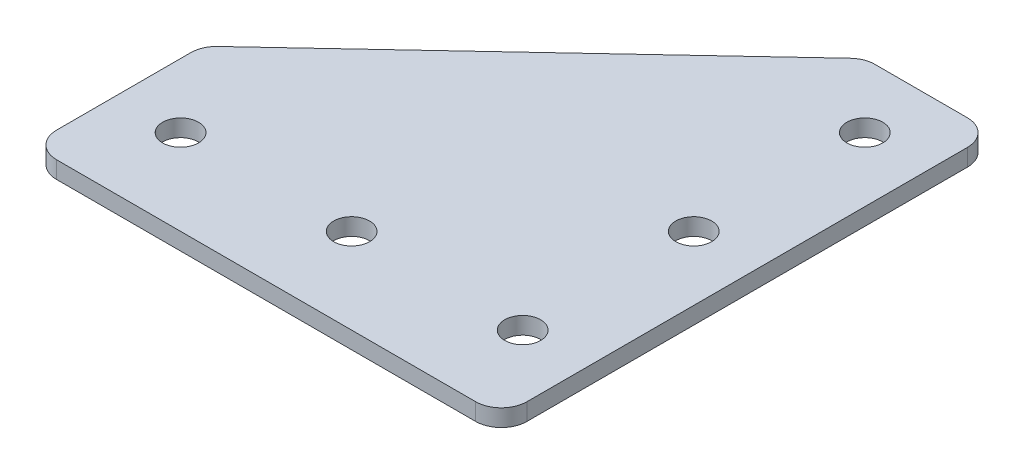
ISO-10303-21;
HEADER;
FILE_DESCRIPTION(('STEP AP214'),'2;1');
FILE_NAME('part.step','',(''),(''),'','','');
FILE_SCHEMA(('AUTOMOTIVE_DESIGN { 1 0 10303 214 1 1 1 1 }'));
ENDSEC;
DATA;
#1=APPLICATION_CONTEXT('core data for automotive mechanical design processes');
#2=APPLICATION_PROTOCOL_DEFINITION('international standard','automotive_design',2000,#1);
#3=PRODUCT_CONTEXT('',#1,'mechanical');
#4=PRODUCT('Part','Part','',(#3));
#5=PRODUCT_RELATED_PRODUCT_CATEGORY('part','',(#4));
#6=PRODUCT_DEFINITION_FORMATION('','',#4);
#7=PRODUCT_DEFINITION_CONTEXT('part definition',#1,'design');
#8=PRODUCT_DEFINITION('design','',#6,#7);
#9=PRODUCT_DEFINITION_SHAPE('','',#8);
#10=(LENGTH_UNIT() NAMED_UNIT(*) SI_UNIT(.MILLI.,.METRE.));
#11=(NAMED_UNIT(*) PLANE_ANGLE_UNIT() SI_UNIT($,.RADIAN.));
#12=(NAMED_UNIT(*) SI_UNIT($,.STERADIAN.) SOLID_ANGLE_UNIT());
#13=UNCERTAINTY_MEASURE_WITH_UNIT(LENGTH_MEASURE(1.E-05),#10,'distance_accuracy_value','');
#14=(GEOMETRIC_REPRESENTATION_CONTEXT(3) GLOBAL_UNCERTAINTY_ASSIGNED_CONTEXT((#13)) GLOBAL_UNIT_ASSIGNED_CONTEXT((#10,
#11,#12)) REPRESENTATION_CONTEXT('',''));
#15=CARTESIAN_POINT('',(0.,0.,0.));
#16=DIRECTION('',(0.,0.,1.));
#17=DIRECTION('',(1.,0.,0.));
#18=AXIS2_PLACEMENT_3D('',#15,#16,#17);
#19=CARTESIAN_POINT('',(0.,2.,0.));
#20=DIRECTION('',(0.,1.,0.));
#21=DIRECTION('',(0.,0.,1.));
#22=AXIS2_PLACEMENT_3D('',#19,#20,#21);
#23=PLANE('',#22);
#24=CARTESIAN_POINT('',(47.5,2.,-50.));
#25=DIRECTION('',(0.,1.,0.));
#26=DIRECTION('',(0.,0.,1.));
#27=AXIS2_PLACEMENT_3D('',#24,#25,#26);
#28=CIRCLE('',#27,2.1);
#29=CARTESIAN_POINT('',(47.5,2.,-47.9));
#30=VERTEX_POINT('',#29);
#31=EDGE_CURVE('E403',#30,#30,#28,.T.);
#32=ORIENTED_EDGE('',*,*,#31,.F.);
#33=EDGE_LOOP('',(#32));
#34=FACE_BOUND('',#33,.T.);
#35=CARTESIAN_POINT('',(47.5,2.,-10.));
#36=DIRECTION('',(0.,1.,0.));
#37=DIRECTION('',(0.,0.,1.));
#38=AXIS2_PLACEMENT_3D('',#35,#36,#37);
#39=CIRCLE('',#38,2.1);
#40=CARTESIAN_POINT('',(47.5,2.,-7.90000000000001));
#41=VERTEX_POINT('',#40);
#42=EDGE_CURVE('E211',#41,#41,#39,.T.);
#43=ORIENTED_EDGE('',*,*,#42,.F.);
#44=EDGE_LOOP('',(#43));
#45=FACE_BOUND('',#44,.T.);
#46=DIRECTION('',(1.,0.,0.));
#47=VECTOR('',#46,1.);
#48=CARTESIAN_POINT('',(0.,2.,0.));
#49=LINE('',#48,#47);
#50=CARTESIAN_POINT('',(3.,2.,0.));
#51=VERTEX_POINT('',#50);
#52=CARTESIAN_POINT('',(52.,2.,0.));
#53=VERTEX_POINT('',#52);
#54=EDGE_CURVE('E219',#51,#53,#49,.T.);
#55=ORIENTED_EDGE('',*,*,#54,.T.);
#56=CARTESIAN_POINT('',(52.,2.,-3.));
#57=DIRECTION('',(0.,1.,0.));
#58=DIRECTION('',(0.,0.,1.));
#59=AXIS2_PLACEMENT_3D('',#56,#57,#58);
#60=CIRCLE('',#59,3.);
#61=CARTESIAN_POINT('',(55.,2.,-3.));
#62=VERTEX_POINT('',#61);
#63=EDGE_CURVE('E172',#53,#62,#60,.T.);
#64=ORIENTED_EDGE('',*,*,#63,.T.);
#65=DIRECTION('',(0.,0.,-1.));
#66=VECTOR('',#65,1.);
#67=CARTESIAN_POINT('',(55.,2.,-57.5));
#68=LINE('',#67,#66);
#69=CARTESIAN_POINT('',(55.,2.,-54.5));
#70=VERTEX_POINT('',#69);
#71=EDGE_CURVE('E135',#62,#70,#68,.T.);
#72=ORIENTED_EDGE('',*,*,#71,.T.);
#73=CARTESIAN_POINT('',(52.,2.,-54.5));
#74=DIRECTION('',(0.,1.,0.));
#75=DIRECTION('',(0.,0.,1.));
#76=AXIS2_PLACEMENT_3D('',#73,#74,#75);
#77=CIRCLE('',#76,3.);
#78=CARTESIAN_POINT('',(52.,2.,-57.5));
#79=VERTEX_POINT('',#78);
#80=EDGE_CURVE('E165',#70,#79,#77,.T.);
#81=ORIENTED_EDGE('',*,*,#80,.T.);
#82=DIRECTION('',(-1.,0.,0.));
#83=VECTOR('',#82,1.);
#84=CARTESIAN_POINT('',(55.,2.,-57.5));
#85=LINE('',#84,#83);
#86=CARTESIAN_POINT('',(41.1863424398923,2.,-57.5));
#87=VERTEX_POINT('',#86);
#88=EDGE_CURVE('E188',#79,#87,#85,.T.);
#89=ORIENTED_EDGE('',*,*,#88,.T.);
#90=CARTESIAN_POINT('',(41.1863424398923,2.,-54.5));
#91=DIRECTION('',(0.,1.,0.));
#92=DIRECTION('',(0.,0.,1.));
#93=AXIS2_PLACEMENT_3D('',#90,#91,#92);
#94=CIRCLE('',#93,3.);
#95=CARTESIAN_POINT('',(39.1345190532483,2.,-56.6886116124203));
#96=VERTEX_POINT('',#95);
#97=EDGE_CURVE('E59',#87,#96,#94,.T.);
#98=ORIENTED_EDGE('',*,*,#97,.T.);
#99=DIRECTION('',(-0.729537204140085,0.,0.68394112888133));
#100=VECTOR('',#99,1.);
#101=CARTESIAN_POINT('',(40.,2.,-57.5));
#102=LINE('',#101,#100);
#103=CARTESIAN_POINT('',(0.948176613356,2.,-20.8889155750212));
#104=VERTEX_POINT('',#103);
#105=EDGE_CURVE('E154',#96,#104,#102,.T.);
#106=ORIENTED_EDGE('',*,*,#105,.T.);
#107=CARTESIAN_POINT('',(3.,2.,-18.700303962601));
#108=DIRECTION('',(0.,1.,0.));
#109=DIRECTION('',(0.,0.,1.));
#110=AXIS2_PLACEMENT_3D('',#107,#108,#109);
#111=CIRCLE('',#110,3.);
#112=CARTESIAN_POINT('',(0.,2.,-18.700303962601));
#113=VERTEX_POINT('',#112);
#114=EDGE_CURVE('E170',#104,#113,#111,.T.);
#115=ORIENTED_EDGE('',*,*,#114,.T.);
#116=DIRECTION('',(0.,0.,1.));
#117=VECTOR('',#116,1.);
#118=CARTESIAN_POINT('',(0.,2.,-20.));
#119=LINE('',#118,#117);
#120=CARTESIAN_POINT('',(0.,2.,-3.));
#121=VERTEX_POINT('',#120);
#122=EDGE_CURVE('E153',#113,#121,#119,.T.);
#123=ORIENTED_EDGE('',*,*,#122,.T.);
#124=CARTESIAN_POINT('',(3.,2.,-3.));
#125=DIRECTION('',(0.,1.,0.));
#126=DIRECTION('',(0.,0.,1.));
#127=AXIS2_PLACEMENT_3D('',#124,#125,#126);
#128=CIRCLE('',#127,3.);
#129=EDGE_CURVE('E168',#121,#51,#128,.T.);
#130=ORIENTED_EDGE('',*,*,#129,.T.);
#131=EDGE_LOOP('',(#55,#64,#72,#81,#89,#98,#106,#115,#123,#130));
#132=FACE_BOUND('',#131,.T.);
#133=CARTESIAN_POINT('',(7.5,2.,-10.));
#134=DIRECTION('',(0.,1.,0.));
#135=DIRECTION('',(0.,0.,1.));
#136=AXIS2_PLACEMENT_3D('',#133,#134,#135);
#137=CIRCLE('',#136,2.1);
#138=CARTESIAN_POINT('',(7.5,2.,-7.9));
#139=VERTEX_POINT('',#138);
#140=EDGE_CURVE('E201',#139,#139,#137,.T.);
#141=ORIENTED_EDGE('',*,*,#140,.F.);
#142=EDGE_LOOP('',(#141));
#143=FACE_BOUND('',#142,.T.);
#144=CARTESIAN_POINT('',(27.5,2.,-10.));
#145=DIRECTION('',(0.,1.,0.));
#146=DIRECTION('',(0.,0.,1.));
#147=AXIS2_PLACEMENT_3D('',#144,#145,#146);
#148=CIRCLE('',#147,2.1);
#149=CARTESIAN_POINT('',(27.5,2.,-7.9));
#150=VERTEX_POINT('',#149);
#151=EDGE_CURVE('E407',#150,#150,#148,.T.);
#152=ORIENTED_EDGE('',*,*,#151,.F.);
#153=EDGE_LOOP('',(#152));
#154=FACE_BOUND('',#153,.T.);
#155=CARTESIAN_POINT('',(47.5,2.,-30.));
#156=DIRECTION('',(0.,1.,0.));
#157=DIRECTION('',(0.,0.,1.));
#158=AXIS2_PLACEMENT_3D('',#155,#156,#157);
#159=CIRCLE('',#158,2.1);
#160=CARTESIAN_POINT('',(47.5,2.,-27.9));
#161=VERTEX_POINT('',#160);
#162=EDGE_CURVE('E398',#161,#161,#159,.T.);
#163=ORIENTED_EDGE('',*,*,#162,.F.);
#164=EDGE_LOOP('',(#163));
#165=FACE_BOUND('',#164,.T.);
#166=ADVANCED_FACE('F37',(#34,#45,#132,#143,#154,#165),#23,.T.);
#167=CARTESIAN_POINT('',(0.,0.,0.));
#168=DIRECTION('',(0.,1.,0.));
#169=DIRECTION('',(0.,0.,1.));
#170=AXIS2_PLACEMENT_3D('',#167,#168,#169);
#171=PLANE('',#170);
#172=DIRECTION('',(0.,0.,-1.));
#173=VECTOR('',#172,1.);
#174=CARTESIAN_POINT('',(55.,0.,-57.5));
#175=LINE('',#174,#173);
#176=CARTESIAN_POINT('',(55.,0.,-3.));
#177=VERTEX_POINT('',#176);
#178=CARTESIAN_POINT('',(55.,0.,-54.5));
#179=VERTEX_POINT('',#178);
#180=EDGE_CURVE('E132',#177,#179,#175,.T.);
#181=ORIENTED_EDGE('',*,*,#180,.F.);
#182=CARTESIAN_POINT('',(52.,0.,-3.));
#183=DIRECTION('',(0.,1.,0.));
#184=DIRECTION('',(0.,0.,1.));
#185=AXIS2_PLACEMENT_3D('',#182,#183,#184);
#186=CIRCLE('',#185,3.);
#187=CARTESIAN_POINT('',(52.,0.,0.));
#188=VERTEX_POINT('',#187);
#189=EDGE_CURVE('E115',#177,#188,#186,.F.);
#190=ORIENTED_EDGE('',*,*,#189,.T.);
#191=DIRECTION('',(1.,0.,0.));
#192=VECTOR('',#191,1.);
#193=CARTESIAN_POINT('',(0.,0.,0.));
#194=LINE('',#193,#192);
#195=CARTESIAN_POINT('',(3.,0.,0.));
#196=VERTEX_POINT('',#195);
#197=EDGE_CURVE('E143',#196,#188,#194,.T.);
#198=ORIENTED_EDGE('',*,*,#197,.F.);
#199=CARTESIAN_POINT('',(3.,0.,-3.));
#200=DIRECTION('',(0.,1.,0.));
#201=DIRECTION('',(0.,0.,1.));
#202=AXIS2_PLACEMENT_3D('',#199,#200,#201);
#203=CIRCLE('',#202,3.);
#204=CARTESIAN_POINT('',(0.,0.,-3.));
#205=VERTEX_POINT('',#204);
#206=EDGE_CURVE('E159',#196,#205,#203,.F.);
#207=ORIENTED_EDGE('',*,*,#206,.T.);
#208=DIRECTION('',(0.,0.,1.));
#209=VECTOR('',#208,1.);
#210=CARTESIAN_POINT('',(0.,0.,-20.));
#211=LINE('',#210,#209);
#212=CARTESIAN_POINT('',(0.,0.,-18.700303962601));
#213=VERTEX_POINT('',#212);
#214=EDGE_CURVE('E148',#213,#205,#211,.T.);
#215=ORIENTED_EDGE('',*,*,#214,.F.);
#216=CARTESIAN_POINT('',(3.,0.,-18.700303962601));
#217=DIRECTION('',(0.,1.,0.));
#218=DIRECTION('',(0.,0.,1.));
#219=AXIS2_PLACEMENT_3D('',#216,#217,#218);
#220=CIRCLE('',#219,3.);
#221=CARTESIAN_POINT('',(0.948176613356,0.,-20.8889155750212));
#222=VERTEX_POINT('',#221);
#223=EDGE_CURVE('E126',#213,#222,#220,.F.);
#224=ORIENTED_EDGE('',*,*,#223,.T.);
#225=DIRECTION('',(-0.729537204140085,0.,0.68394112888133));
#226=VECTOR('',#225,1.);
#227=CARTESIAN_POINT('',(40.,0.,-57.5));
#228=LINE('',#227,#226);
#229=CARTESIAN_POINT('',(39.1345190532483,0.,-56.6886116124203));
#230=VERTEX_POINT('',#229);
#231=EDGE_CURVE('E146',#230,#222,#228,.T.);
#232=ORIENTED_EDGE('',*,*,#231,.F.);
#233=CARTESIAN_POINT('',(41.1863424398923,0.,-54.5));
#234=DIRECTION('',(0.,1.,0.));
#235=DIRECTION('',(0.,0.,1.));
#236=AXIS2_PLACEMENT_3D('',#233,#234,#235);
#237=CIRCLE('',#236,3.);
#238=CARTESIAN_POINT('',(41.1863424398923,0.,-57.5));
#239=VERTEX_POINT('',#238);
#240=EDGE_CURVE('E157',#230,#239,#237,.F.);
#241=ORIENTED_EDGE('',*,*,#240,.T.);
#242=DIRECTION('',(-1.,0.,0.));
#243=VECTOR('',#242,1.);
#244=CARTESIAN_POINT('',(55.,0.,-57.5));
#245=LINE('',#244,#243);
#246=CARTESIAN_POINT('',(52.,0.,-57.5));
#247=VERTEX_POINT('',#246);
#248=EDGE_CURVE('E142',#247,#239,#245,.T.);
#249=ORIENTED_EDGE('',*,*,#248,.F.);
#250=CARTESIAN_POINT('',(52.,0.,-54.5));
#251=DIRECTION('',(0.,1.,0.));
#252=DIRECTION('',(0.,0.,1.));
#253=AXIS2_PLACEMENT_3D('',#250,#251,#252);
#254=CIRCLE('',#253,3.);
#255=EDGE_CURVE('E136',#247,#179,#254,.F.);
#256=ORIENTED_EDGE('',*,*,#255,.T.);
#257=EDGE_LOOP('',(#181,#190,#198,#207,#215,#224,#232,#241,#249,#256));
#258=FACE_BOUND('',#257,.T.);
#259=CARTESIAN_POINT('',(7.5,0.,-10.));
#260=DIRECTION('',(0.,1.,0.));
#261=DIRECTION('',(0.,0.,1.));
#262=AXIS2_PLACEMENT_3D('',#259,#260,#261);
#263=CIRCLE('',#262,2.1);
#264=CARTESIAN_POINT('',(7.5,0.,-7.9));
#265=VERTEX_POINT('',#264);
#266=EDGE_CURVE('E206',#265,#265,#263,.T.);
#267=ORIENTED_EDGE('',*,*,#266,.T.);
#268=EDGE_LOOP('',(#267));
#269=FACE_BOUND('',#268,.T.);
#270=CARTESIAN_POINT('',(47.5,0.,-10.));
#271=DIRECTION('',(0.,1.,0.));
#272=DIRECTION('',(0.,0.,1.));
#273=AXIS2_PLACEMENT_3D('',#270,#271,#272);
#274=CIRCLE('',#273,2.1);
#275=CARTESIAN_POINT('',(47.5,0.,-7.90000000000001));
#276=VERTEX_POINT('',#275);
#277=EDGE_CURVE('E214',#276,#276,#274,.T.);
#278=ORIENTED_EDGE('',*,*,#277,.T.);
#279=EDGE_LOOP('',(#278));
#280=FACE_BOUND('',#279,.T.);
#281=CARTESIAN_POINT('',(27.5,0.,-10.));
#282=DIRECTION('',(0.,1.,0.));
#283=DIRECTION('',(0.,0.,1.));
#284=AXIS2_PLACEMENT_3D('',#281,#282,#283);
#285=CIRCLE('',#284,2.1);
#286=CARTESIAN_POINT('',(27.5,0.,-7.9));
#287=VERTEX_POINT('',#286);
#288=EDGE_CURVE('E389',#287,#287,#285,.T.);
#289=ORIENTED_EDGE('',*,*,#288,.T.);
#290=EDGE_LOOP('',(#289));
#291=FACE_BOUND('',#290,.T.);
#292=CARTESIAN_POINT('',(47.5,0.,-50.));
#293=DIRECTION('',(0.,1.,0.));
#294=DIRECTION('',(0.,0.,1.));
#295=AXIS2_PLACEMENT_3D('',#292,#293,#294);
#296=CIRCLE('',#295,2.1);
#297=CARTESIAN_POINT('',(47.5,0.,-47.9));
#298=VERTEX_POINT('',#297);
#299=EDGE_CURVE('E393',#298,#298,#296,.T.);
#300=ORIENTED_EDGE('',*,*,#299,.T.);
#301=EDGE_LOOP('',(#300));
#302=FACE_BOUND('',#301,.T.);
#303=CARTESIAN_POINT('',(47.5,0.,-30.));
#304=DIRECTION('',(0.,1.,0.));
#305=DIRECTION('',(0.,0.,1.));
#306=AXIS2_PLACEMENT_3D('',#303,#304,#305);
#307=CIRCLE('',#306,2.1);
#308=CARTESIAN_POINT('',(47.5,0.,-27.9));
#309=VERTEX_POINT('',#308);
#310=EDGE_CURVE('E396',#309,#309,#307,.T.);
#311=ORIENTED_EDGE('',*,*,#310,.T.);
#312=EDGE_LOOP('',(#311));
#313=FACE_BOUND('',#312,.T.);
#314=ADVANCED_FACE('F139',(#258,#269,#280,#291,#302,#313),#171,.F.);
#315=CARTESIAN_POINT('',(0.,2.,-20.));
#316=DIRECTION('',(1.,0.,0.));
#317=DIRECTION('',(0.,0.,-1.));
#318=AXIS2_PLACEMENT_3D('',#315,#316,#317);
#319=PLANE('',#318);
#320=ORIENTED_EDGE('',*,*,#122,.F.);
#321=DIRECTION('',(0.,-1.,0.));
#322=VECTOR('',#321,1.);
#323=CARTESIAN_POINT('',(0.,2.,-18.700303962601));
#324=LINE('',#323,#322);
#325=EDGE_CURVE('E176',#113,#213,#324,.T.);
#326=ORIENTED_EDGE('',*,*,#325,.T.);
#327=ORIENTED_EDGE('',*,*,#214,.T.);
#328=DIRECTION('',(0.,-1.,0.));
#329=VECTOR('',#328,1.);
#330=CARTESIAN_POINT('',(0.,2.,-3.));
#331=LINE('',#330,#329);
#332=EDGE_CURVE('E174',#205,#121,#331,.F.);
#333=ORIENTED_EDGE('',*,*,#332,.T.);
#334=EDGE_LOOP('',(#320,#326,#327,#333));
#335=FACE_BOUND('',#334,.T.);
#336=ADVANCED_FACE('F233',(#335),#319,.F.);
#337=CARTESIAN_POINT('',(0.,2.,0.));
#338=DIRECTION('',(0.,0.,-1.));
#339=DIRECTION('',(-1.,0.,0.));
#340=AXIS2_PLACEMENT_3D('',#337,#338,#339);
#341=PLANE('',#340);
#342=ORIENTED_EDGE('',*,*,#197,.T.);
#343=DIRECTION('',(0.,-1.,0.));
#344=VECTOR('',#343,1.);
#345=CARTESIAN_POINT('',(52.,2.,0.));
#346=LINE('',#345,#344);
#347=EDGE_CURVE('E120',#188,#53,#346,.F.);
#348=ORIENTED_EDGE('',*,*,#347,.T.);
#349=ORIENTED_EDGE('',*,*,#54,.F.);
#350=DIRECTION('',(0.,-1.,0.));
#351=VECTOR('',#350,1.);
#352=CARTESIAN_POINT('',(3.,2.,0.));
#353=LINE('',#352,#351);
#354=EDGE_CURVE('E125',#51,#196,#353,.T.);
#355=ORIENTED_EDGE('',*,*,#354,.T.);
#356=EDGE_LOOP('',(#342,#348,#349,#355));
#357=FACE_BOUND('',#356,.T.);
#358=ADVANCED_FACE('F247',(#357),#341,.F.);
#359=CARTESIAN_POINT('',(55.,2.,-57.5));
#360=DIRECTION('',(-1.,0.,0.));
#361=DIRECTION('',(0.,0.,1.));
#362=AXIS2_PLACEMENT_3D('',#359,#360,#361);
#363=PLANE('',#362);
#364=ORIENTED_EDGE('',*,*,#71,.F.);
#365=DIRECTION('',(0.,-1.,0.));
#366=VECTOR('',#365,1.);
#367=CARTESIAN_POINT('',(55.,2.,-3.));
#368=LINE('',#367,#366);
#369=EDGE_CURVE('E119',#62,#177,#368,.T.);
#370=ORIENTED_EDGE('',*,*,#369,.T.);
#371=ORIENTED_EDGE('',*,*,#180,.T.);
#372=DIRECTION('',(0.,-1.,0.));
#373=VECTOR('',#372,1.);
#374=CARTESIAN_POINT('',(55.,2.,-54.5));
#375=LINE('',#374,#373);
#376=EDGE_CURVE('E137',#179,#70,#375,.F.);
#377=ORIENTED_EDGE('',*,*,#376,.T.);
#378=EDGE_LOOP('',(#364,#370,#371,#377));
#379=FACE_BOUND('',#378,.T.);
#380=ADVANCED_FACE('F131',(#379),#363,.F.);
#381=CARTESIAN_POINT('',(55.,2.,-57.5));
#382=DIRECTION('',(0.,0.,1.));
#383=DIRECTION('',(1.,0.,0.));
#384=AXIS2_PLACEMENT_3D('',#381,#382,#383);
#385=PLANE('',#384);
#386=ORIENTED_EDGE('',*,*,#248,.T.);
#387=DIRECTION('',(0.,-1.,0.));
#388=VECTOR('',#387,1.);
#389=CARTESIAN_POINT('',(41.1863424398923,2.,-57.5));
#390=LINE('',#389,#388);
#391=EDGE_CURVE('E11',#239,#87,#390,.F.);
#392=ORIENTED_EDGE('',*,*,#391,.T.);
#393=ORIENTED_EDGE('',*,*,#88,.F.);
#394=DIRECTION('',(0.,-1.,0.));
#395=VECTOR('',#394,1.);
#396=CARTESIAN_POINT('',(52.,2.,-57.5));
#397=LINE('',#396,#395);
#398=EDGE_CURVE('E45',#79,#247,#397,.T.);
#399=ORIENTED_EDGE('',*,*,#398,.T.);
#400=EDGE_LOOP('',(#386,#392,#393,#399));
#401=FACE_BOUND('',#400,.T.);
#402=ADVANCED_FACE('F186',(#401),#385,.F.);
#403=CARTESIAN_POINT('',(40.,2.,-57.5));
#404=DIRECTION('',(0.68394112888133,0.,0.729537204140085));
#405=DIRECTION('',(0.729537204140085,0.,-0.68394112888133));
#406=AXIS2_PLACEMENT_3D('',#403,#404,#405);
#407=PLANE('',#406);
#408=ORIENTED_EDGE('',*,*,#231,.T.);
#409=DIRECTION('',(0.,-1.,0.));
#410=VECTOR('',#409,1.);
#411=CARTESIAN_POINT('',(0.948176613356007,2.,-20.8889155750213));
#412=LINE('',#411,#410);
#413=EDGE_CURVE('E52',#222,#104,#412,.F.);
#414=ORIENTED_EDGE('',*,*,#413,.T.);
#415=ORIENTED_EDGE('',*,*,#105,.F.);
#416=DIRECTION('',(0.,-1.,0.));
#417=VECTOR('',#416,1.);
#418=CARTESIAN_POINT('',(39.1345190532483,2.,-56.6886116124203));
#419=LINE('',#418,#417);
#420=EDGE_CURVE('E179',#96,#230,#419,.T.);
#421=ORIENTED_EDGE('',*,*,#420,.T.);
#422=EDGE_LOOP('',(#408,#414,#415,#421));
#423=FACE_BOUND('',#422,.T.);
#424=ADVANCED_FACE('F195',(#423),#407,.F.);
#425=CARTESIAN_POINT('',(7.5,2.,-10.));
#426=DIRECTION('',(0.,-1.,0.));
#427=DIRECTION('',(0.,0.,-1.));
#428=AXIS2_PLACEMENT_3D('',#425,#426,#427);
#429=CYLINDRICAL_SURFACE('',#428,2.1);
#430=ORIENTED_EDGE('',*,*,#140,.T.);
#431=EDGE_LOOP('',(#430));
#432=FACE_BOUND('',#431,.T.);
#433=ORIENTED_EDGE('',*,*,#266,.F.);
#434=EDGE_LOOP('',(#433));
#435=FACE_BOUND('',#434,.T.);
#436=ADVANCED_FACE('F238',(#432,#435),#429,.F.);
#437=CARTESIAN_POINT('',(47.5,2.,-10.));
#438=DIRECTION('',(0.,-1.,0.));
#439=DIRECTION('',(0.,0.,-1.));
#440=AXIS2_PLACEMENT_3D('',#437,#438,#439);
#441=CYLINDRICAL_SURFACE('',#440,2.1);
#442=ORIENTED_EDGE('',*,*,#42,.T.);
#443=EDGE_LOOP('',(#442));
#444=FACE_BOUND('',#443,.T.);
#445=ORIENTED_EDGE('',*,*,#277,.F.);
#446=EDGE_LOOP('',(#445));
#447=FACE_BOUND('',#446,.T.);
#448=ADVANCED_FACE('F319',(#444,#447),#441,.F.);
#449=CARTESIAN_POINT('',(27.5,2.,-10.));
#450=DIRECTION('',(0.,-1.,0.));
#451=DIRECTION('',(0.,0.,-1.));
#452=AXIS2_PLACEMENT_3D('',#449,#450,#451);
#453=CYLINDRICAL_SURFACE('',#452,2.1);
#454=ORIENTED_EDGE('',*,*,#151,.T.);
#455=EDGE_LOOP('',(#454));
#456=FACE_BOUND('',#455,.T.);
#457=ORIENTED_EDGE('',*,*,#288,.F.);
#458=EDGE_LOOP('',(#457));
#459=FACE_BOUND('',#458,.T.);
#460=ADVANCED_FACE('F310',(#456,#459),#453,.F.);
#461=CARTESIAN_POINT('',(47.5,2.,-50.));
#462=DIRECTION('',(0.,-1.,0.));
#463=DIRECTION('',(0.,0.,-1.));
#464=AXIS2_PLACEMENT_3D('',#461,#462,#463);
#465=CYLINDRICAL_SURFACE('',#464,2.1);
#466=ORIENTED_EDGE('',*,*,#31,.T.);
#467=EDGE_LOOP('',(#466));
#468=FACE_BOUND('',#467,.T.);
#469=ORIENTED_EDGE('',*,*,#299,.F.);
#470=EDGE_LOOP('',(#469));
#471=FACE_BOUND('',#470,.T.);
#472=ADVANCED_FACE('F301',(#468,#471),#465,.F.);
#473=CARTESIAN_POINT('',(47.5,2.,-30.));
#474=DIRECTION('',(0.,-1.,0.));
#475=DIRECTION('',(0.,0.,-1.));
#476=AXIS2_PLACEMENT_3D('',#473,#474,#475);
#477=CYLINDRICAL_SURFACE('',#476,2.1);
#478=ORIENTED_EDGE('',*,*,#162,.T.);
#479=EDGE_LOOP('',(#478));
#480=FACE_BOUND('',#479,.T.);
#481=ORIENTED_EDGE('',*,*,#310,.F.);
#482=EDGE_LOOP('',(#481));
#483=FACE_BOUND('',#482,.T.);
#484=ADVANCED_FACE('F256',(#480,#483),#477,.F.);
#485=CARTESIAN_POINT('',(52.,2.,-3.));
#486=DIRECTION('',(0.,-1.,0.));
#487=DIRECTION('',(0.,0.,-1.));
#488=AXIS2_PLACEMENT_3D('',#485,#486,#487);
#489=CYLINDRICAL_SURFACE('',#488,3.);
#490=ORIENTED_EDGE('',*,*,#63,.F.);
#491=ORIENTED_EDGE('',*,*,#347,.F.);
#492=ORIENTED_EDGE('',*,*,#189,.F.);
#493=ORIENTED_EDGE('',*,*,#369,.F.);
#494=EDGE_LOOP('',(#490,#491,#492,#493));
#495=FACE_BOUND('',#494,.T.);
#496=ADVANCED_FACE('F118',(#495),#489,.T.);
#497=CARTESIAN_POINT('',(3.,2.,-18.700303962601));
#498=DIRECTION('',(0.,-1.,0.));
#499=DIRECTION('',(0.,0.,-1.));
#500=AXIS2_PLACEMENT_3D('',#497,#498,#499);
#501=CYLINDRICAL_SURFACE('',#500,3.);
#502=ORIENTED_EDGE('',*,*,#114,.F.);
#503=ORIENTED_EDGE('',*,*,#413,.F.);
#504=ORIENTED_EDGE('',*,*,#223,.F.);
#505=ORIENTED_EDGE('',*,*,#325,.F.);
#506=EDGE_LOOP('',(#502,#503,#504,#505));
#507=FACE_BOUND('',#506,.T.);
#508=ADVANCED_FACE('F255',(#507),#501,.T.);
#509=CARTESIAN_POINT('',(3.,2.,-3.));
#510=DIRECTION('',(0.,-1.,0.));
#511=DIRECTION('',(0.,0.,-1.));
#512=AXIS2_PLACEMENT_3D('',#509,#510,#511);
#513=CYLINDRICAL_SURFACE('',#512,3.);
#514=ORIENTED_EDGE('',*,*,#129,.F.);
#515=ORIENTED_EDGE('',*,*,#332,.F.);
#516=ORIENTED_EDGE('',*,*,#206,.F.);
#517=ORIENTED_EDGE('',*,*,#354,.F.);
#518=EDGE_LOOP('',(#514,#515,#516,#517));
#519=FACE_BOUND('',#518,.T.);
#520=ADVANCED_FACE('F226',(#519),#513,.T.);
#521=CARTESIAN_POINT('',(41.1863424398923,2.,-54.5));
#522=DIRECTION('',(0.,-1.,0.));
#523=DIRECTION('',(0.,0.,-1.));
#524=AXIS2_PLACEMENT_3D('',#521,#522,#523);
#525=CYLINDRICAL_SURFACE('',#524,3.);
#526=ORIENTED_EDGE('',*,*,#97,.F.);
#527=ORIENTED_EDGE('',*,*,#391,.F.);
#528=ORIENTED_EDGE('',*,*,#240,.F.);
#529=ORIENTED_EDGE('',*,*,#420,.F.);
#530=EDGE_LOOP('',(#526,#527,#528,#529));
#531=FACE_BOUND('',#530,.T.);
#532=ADVANCED_FACE('F194',(#531),#525,.T.);
#533=CARTESIAN_POINT('',(52.,2.,-54.5));
#534=DIRECTION('',(0.,-1.,0.));
#535=DIRECTION('',(0.,0.,-1.));
#536=AXIS2_PLACEMENT_3D('',#533,#534,#535);
#537=CYLINDRICAL_SURFACE('',#536,3.);
#538=ORIENTED_EDGE('',*,*,#80,.F.);
#539=ORIENTED_EDGE('',*,*,#376,.F.);
#540=ORIENTED_EDGE('',*,*,#255,.F.);
#541=ORIENTED_EDGE('',*,*,#398,.F.);
#542=EDGE_LOOP('',(#538,#539,#540,#541));
#543=FACE_BOUND('',#542,.T.);
#544=ADVANCED_FACE('F39',(#543),#537,.T.);
#545=CLOSED_SHELL('',(#166,#314,#336,#358,#380,#402,#424,#436,#448,#460,#472,#484,#496,#508,
#520,#532,#544));
#546=MANIFOLD_SOLID_BREP('B2',#545);
#547=ADVANCED_BREP_SHAPE_REPRESENTATION('',(#18,#546),#14);
#548=SHAPE_DEFINITION_REPRESENTATION(#9,#547);
ENDSEC;
END-ISO-10303-21;
